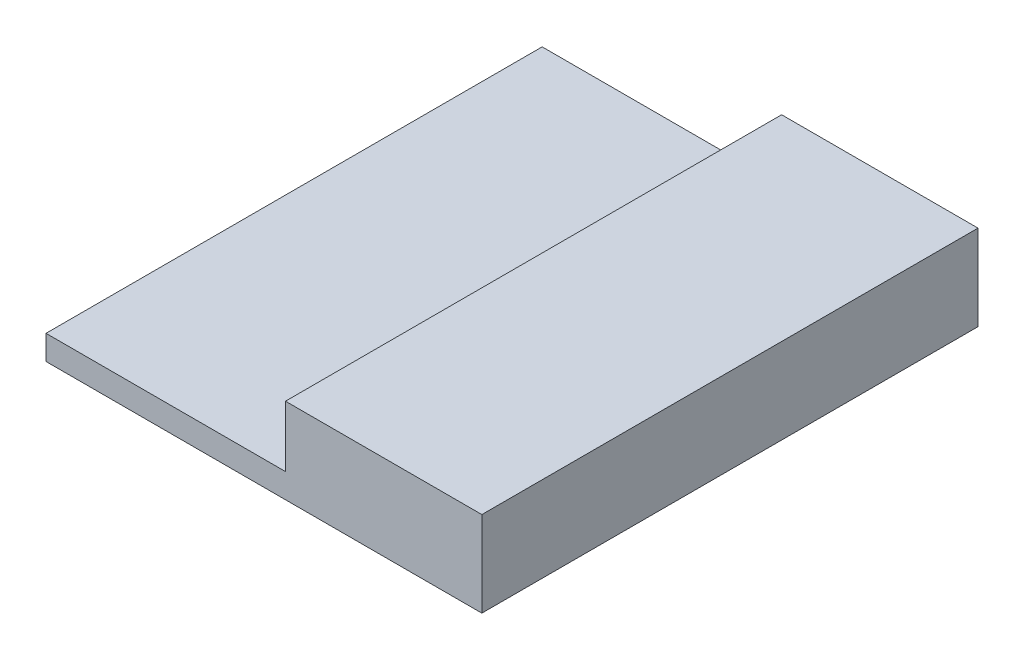
ISO-10303-21;
HEADER;
FILE_DESCRIPTION(('STEP AP214'),'2;1');
FILE_NAME('part.step','',(''),(''),'','','');
FILE_SCHEMA(('AUTOMOTIVE_DESIGN { 1 0 10303 214 1 1 1 1 }'));
ENDSEC;
DATA;
#1=APPLICATION_CONTEXT('core data for automotive mechanical design processes');
#2=APPLICATION_PROTOCOL_DEFINITION('international standard','automotive_design',2000,#1);
#3=PRODUCT_CONTEXT('',#1,'mechanical');
#4=PRODUCT('Part','Part','',(#3));
#5=PRODUCT_RELATED_PRODUCT_CATEGORY('part','',(#4));
#6=PRODUCT_DEFINITION_FORMATION('','',#4);
#7=PRODUCT_DEFINITION_CONTEXT('part definition',#1,'design');
#8=PRODUCT_DEFINITION('design','',#6,#7);
#9=PRODUCT_DEFINITION_SHAPE('','',#8);
#10=(LENGTH_UNIT() NAMED_UNIT(*) SI_UNIT(.MILLI.,.METRE.));
#11=(NAMED_UNIT(*) PLANE_ANGLE_UNIT() SI_UNIT($,.RADIAN.));
#12=(NAMED_UNIT(*) SI_UNIT($,.STERADIAN.) SOLID_ANGLE_UNIT());
#13=UNCERTAINTY_MEASURE_WITH_UNIT(LENGTH_MEASURE(1.E-05),#10,'distance_accuracy_value','');
#14=(GEOMETRIC_REPRESENTATION_CONTEXT(3) GLOBAL_UNCERTAINTY_ASSIGNED_CONTEXT((#13)) GLOBAL_UNIT_ASSIGNED_CONTEXT((#10,
#11,#12)) REPRESENTATION_CONTEXT('',''));
#15=CARTESIAN_POINT('',(0.,0.,0.));
#16=DIRECTION('',(0.,0.,1.));
#17=DIRECTION('',(1.,0.,0.));
#18=AXIS2_PLACEMENT_3D('',#15,#16,#17);
#19=CARTESIAN_POINT('',(0.,41.,0.));
#20=DIRECTION('',(1.,0.,0.));
#21=DIRECTION('',(0.,0.,-1.));
#22=AXIS2_PLACEMENT_3D('',#19,#20,#21);
#23=PLANE('',#22);
#24=DIRECTION('',(0.,0.,-1.));
#25=VECTOR('',#24,1.);
#26=CARTESIAN_POINT('',(0.,11.7294936469273,-123.247490410854));
#27=LINE('',#26,#25);
#28=CARTESIAN_POINT('',(0.,11.7294936469273,0.));
#29=VERTEX_POINT('',#28);
#30=CARTESIAN_POINT('',(0.,11.7294936469273,-238.247490410854));
#31=VERTEX_POINT('',#30);
#32=EDGE_CURVE('E53',#29,#31,#27,.T.);
#33=ORIENTED_EDGE('',*,*,#32,.F.);
#34=DIRECTION('',(0.,-1.,0.));
#35=VECTOR('',#34,1.);
#36=CARTESIAN_POINT('',(0.,41.,0.));
#37=LINE('',#36,#35);
#38=CARTESIAN_POINT('',(0.,41.,0.));
#39=VERTEX_POINT('',#38);
#40=EDGE_CURVE('E11',#39,#29,#37,.T.);
#41=ORIENTED_EDGE('',*,*,#40,.F.);
#42=DIRECTION('',(0.,0.,1.));
#43=VECTOR('',#42,1.);
#44=CARTESIAN_POINT('',(0.,41.,0.));
#45=LINE('',#44,#43);
#46=CARTESIAN_POINT('',(0.,41.,-238.247490410854));
#47=VERTEX_POINT('',#46);
#48=EDGE_CURVE('E135',#47,#39,#45,.T.);
#49=ORIENTED_EDGE('',*,*,#48,.F.);
#50=DIRECTION('',(0.,1.,0.));
#51=VECTOR('',#50,1.);
#52=CARTESIAN_POINT('',(0.,0.,-238.247490410854));
#53=LINE('',#52,#51);
#54=EDGE_CURVE('E123',#31,#47,#53,.T.);
#55=ORIENTED_EDGE('',*,*,#54,.F.);
#56=EDGE_LOOP('',(#33,#41,#49,#55));
#57=FACE_BOUND('',#56,.T.);
#58=ADVANCED_FACE('F39',(#57),#23,.F.);
#59=CARTESIAN_POINT('',(0.,41.,0.));
#60=DIRECTION('',(0.,0.,-1.));
#61=DIRECTION('',(-1.,0.,0.));
#62=AXIS2_PLACEMENT_3D('',#59,#60,#61);
#63=PLANE('',#62);
#64=DIRECTION('',(1.,0.,0.));
#65=VECTOR('',#64,1.);
#66=CARTESIAN_POINT('',(0.,0.,0.));
#67=LINE('',#66,#65);
#68=CARTESIAN_POINT('',(-115.,0.,0.));
#69=VERTEX_POINT('',#68);
#70=CARTESIAN_POINT('',(94.2941117111616,0.,0.));
#71=VERTEX_POINT('',#70);
#72=EDGE_CURVE('E71',#69,#71,#67,.T.);
#73=ORIENTED_EDGE('',*,*,#72,.T.);
#74=DIRECTION('',(0.,-1.,0.));
#75=VECTOR('',#74,1.);
#76=CARTESIAN_POINT('',(94.2941117111616,41.,0.));
#77=LINE('',#76,#75);
#78=CARTESIAN_POINT('',(94.2941117111616,41.,0.));
#79=VERTEX_POINT('',#78);
#80=EDGE_CURVE('E46',#79,#71,#77,.T.);
#81=ORIENTED_EDGE('',*,*,#80,.F.);
#82=DIRECTION('',(1.,0.,0.));
#83=VECTOR('',#82,1.);
#84=CARTESIAN_POINT('',(0.,41.,0.));
#85=LINE('',#84,#83);
#86=EDGE_CURVE('E61',#39,#79,#85,.T.);
#87=ORIENTED_EDGE('',*,*,#86,.F.);
#88=ORIENTED_EDGE('',*,*,#40,.T.);
#89=DIRECTION('',(1.,0.,0.));
#90=VECTOR('',#89,1.);
#91=CARTESIAN_POINT('',(-115.,11.7294936469273,0.));
#92=LINE('',#91,#90);
#93=CARTESIAN_POINT('',(-115.,11.7294936469273,0.));
#94=VERTEX_POINT('',#93);
#95=EDGE_CURVE('E131',#94,#29,#92,.T.);
#96=ORIENTED_EDGE('',*,*,#95,.F.);
#97=DIRECTION('',(0.,1.,0.));
#98=VECTOR('',#97,1.);
#99=CARTESIAN_POINT('',(-115.,0.,0.));
#100=LINE('',#99,#98);
#101=EDGE_CURVE('E78',#69,#94,#100,.T.);
#102=ORIENTED_EDGE('',*,*,#101,.F.);
#103=EDGE_LOOP('',(#73,#81,#87,#88,#96,#102));
#104=FACE_BOUND('',#103,.T.);
#105=ADVANCED_FACE('F145',(#104),#63,.F.);
#106=CARTESIAN_POINT('',(94.2941117111616,41.,0.));
#107=DIRECTION('',(-1.,0.,0.));
#108=DIRECTION('',(0.,0.,1.));
#109=AXIS2_PLACEMENT_3D('',#106,#107,#108);
#110=PLANE('',#109);
#111=DIRECTION('',(0.,0.,-1.));
#112=VECTOR('',#111,1.);
#113=CARTESIAN_POINT('',(94.2941117111616,0.,0.));
#114=LINE('',#113,#112);
#115=CARTESIAN_POINT('',(94.2941117111616,0.,-238.247490410854));
#116=VERTEX_POINT('',#115);
#117=EDGE_CURVE('E137',#71,#116,#114,.T.);
#118=ORIENTED_EDGE('',*,*,#117,.T.);
#119=DIRECTION('',(0.,-1.,0.));
#120=VECTOR('',#119,1.);
#121=CARTESIAN_POINT('',(94.2941117111616,0.,-238.247490410854));
#122=LINE('',#121,#120);
#123=CARTESIAN_POINT('',(94.2941117111616,41.,-238.247490410854));
#124=VERTEX_POINT('',#123);
#125=EDGE_CURVE('E119',#124,#116,#122,.T.);
#126=ORIENTED_EDGE('',*,*,#125,.F.);
#127=DIRECTION('',(0.,0.,-1.));
#128=VECTOR('',#127,1.);
#129=CARTESIAN_POINT('',(94.2941117111616,41.,0.));
#130=LINE('',#129,#128);
#131=EDGE_CURVE('E139',#79,#124,#130,.T.);
#132=ORIENTED_EDGE('',*,*,#131,.F.);
#133=ORIENTED_EDGE('',*,*,#80,.T.);
#134=EDGE_LOOP('',(#118,#126,#132,#133));
#135=FACE_BOUND('',#134,.T.);
#136=ADVANCED_FACE('F144',(#135),#110,.F.);
#137=CARTESIAN_POINT('',(0.,41.,0.));
#138=DIRECTION('',(0.,-1.,0.));
#139=DIRECTION('',(0.,0.,-1.));
#140=AXIS2_PLACEMENT_3D('',#137,#138,#139);
#141=PLANE('',#140);
#142=ORIENTED_EDGE('',*,*,#48,.T.);
#143=ORIENTED_EDGE('',*,*,#86,.T.);
#144=ORIENTED_EDGE('',*,*,#131,.T.);
#145=DIRECTION('',(1.,0.,0.));
#146=VECTOR('',#145,1.);
#147=CARTESIAN_POINT('',(0.,41.,-238.247490410854));
#148=LINE('',#147,#146);
#149=EDGE_CURVE('E126',#47,#124,#148,.T.);
#150=ORIENTED_EDGE('',*,*,#149,.F.);
#151=EDGE_LOOP('',(#142,#143,#144,#150));
#152=FACE_BOUND('',#151,.T.);
#153=ADVANCED_FACE('F147',(#152),#141,.F.);
#154=CARTESIAN_POINT('',(0.,0.,0.));
#155=DIRECTION('',(0.,-1.,0.));
#156=DIRECTION('',(0.,0.,-1.));
#157=AXIS2_PLACEMENT_3D('',#154,#155,#156);
#158=PLANE('',#157);
#159=ORIENTED_EDGE('',*,*,#72,.F.);
#160=DIRECTION('',(0.,0.,1.));
#161=VECTOR('',#160,1.);
#162=CARTESIAN_POINT('',(-115.,0.,-123.247490410854));
#163=LINE('',#162,#161);
#164=CARTESIAN_POINT('',(-115.,0.,-238.247490410854));
#165=VERTEX_POINT('',#164);
#166=EDGE_CURVE('E98',#165,#69,#163,.T.);
#167=ORIENTED_EDGE('',*,*,#166,.F.);
#168=DIRECTION('',(-1.,0.,0.));
#169=VECTOR('',#168,1.);
#170=CARTESIAN_POINT('',(0.,0.,-238.247490410854));
#171=LINE('',#170,#169);
#172=EDGE_CURVE('E103',#116,#165,#171,.T.);
#173=ORIENTED_EDGE('',*,*,#172,.F.);
#174=ORIENTED_EDGE('',*,*,#117,.F.);
#175=EDGE_LOOP('',(#159,#167,#173,#174));
#176=FACE_BOUND('',#175,.T.);
#177=ADVANCED_FACE('F100',(#176),#158,.T.);
#178=CARTESIAN_POINT('',(-115.,11.7294936469273,-123.247490410854));
#179=DIRECTION('',(0.,-1.,0.));
#180=DIRECTION('',(0.,0.,-1.));
#181=AXIS2_PLACEMENT_3D('',#178,#179,#180);
#182=PLANE('',#181);
#183=ORIENTED_EDGE('',*,*,#32,.T.);
#184=DIRECTION('',(1.,0.,0.));
#185=VECTOR('',#184,1.);
#186=CARTESIAN_POINT('',(0.,11.7294936469273,-238.247490410854));
#187=LINE('',#186,#185);
#188=CARTESIAN_POINT('',(-115.,11.7294936469273,-238.247490410854));
#189=VERTEX_POINT('',#188);
#190=EDGE_CURVE('E113',#189,#31,#187,.T.);
#191=ORIENTED_EDGE('',*,*,#190,.F.);
#192=DIRECTION('',(0.,0.,-1.));
#193=VECTOR('',#192,1.);
#194=CARTESIAN_POINT('',(-115.,11.7294936469273,-123.247490410854));
#195=LINE('',#194,#193);
#196=EDGE_CURVE('E109',#94,#189,#195,.T.);
#197=ORIENTED_EDGE('',*,*,#196,.F.);
#198=ORIENTED_EDGE('',*,*,#95,.T.);
#199=EDGE_LOOP('',(#183,#191,#197,#198));
#200=FACE_BOUND('',#199,.T.);
#201=ADVANCED_FACE('F159',(#200),#182,.F.);
#202=CARTESIAN_POINT('',(-115.,0.,0.));
#203=DIRECTION('',(1.,0.,0.));
#204=DIRECTION('',(0.,0.,-1.));
#205=AXIS2_PLACEMENT_3D('',#202,#203,#204);
#206=PLANE('',#205);
#207=ORIENTED_EDGE('',*,*,#196,.T.);
#208=DIRECTION('',(0.,1.,0.));
#209=VECTOR('',#208,1.);
#210=CARTESIAN_POINT('',(-115.,0.,-238.247490410854));
#211=LINE('',#210,#209);
#212=EDGE_CURVE('E106',#165,#189,#211,.T.);
#213=ORIENTED_EDGE('',*,*,#212,.F.);
#214=ORIENTED_EDGE('',*,*,#166,.T.);
#215=ORIENTED_EDGE('',*,*,#101,.T.);
#216=EDGE_LOOP('',(#207,#213,#214,#215));
#217=FACE_BOUND('',#216,.T.);
#218=ADVANCED_FACE('F107',(#217),#206,.F.);
#219=CARTESIAN_POINT('',(0.,0.,-238.247490410854));
#220=DIRECTION('',(0.,0.,-1.));
#221=DIRECTION('',(-1.,0.,0.));
#222=AXIS2_PLACEMENT_3D('',#219,#220,#221);
#223=PLANE('',#222);
#224=ORIENTED_EDGE('',*,*,#172,.T.);
#225=ORIENTED_EDGE('',*,*,#212,.T.);
#226=ORIENTED_EDGE('',*,*,#190,.T.);
#227=ORIENTED_EDGE('',*,*,#54,.T.);
#228=ORIENTED_EDGE('',*,*,#149,.T.);
#229=ORIENTED_EDGE('',*,*,#125,.T.);
#230=EDGE_LOOP('',(#224,#225,#226,#227,#228,#229));
#231=FACE_BOUND('',#230,.T.);
#232=ADVANCED_FACE('F116',(#231),#223,.T.);
#233=CLOSED_SHELL('',(#58,#105,#136,#153,#177,#201,#218,#232));
#234=MANIFOLD_SOLID_BREP('B2',#233);
#235=ADVANCED_BREP_SHAPE_REPRESENTATION('',(#18,#234),#14);
#236=SHAPE_DEFINITION_REPRESENTATION(#9,#235);
ENDSEC;
END-ISO-10303-21;
